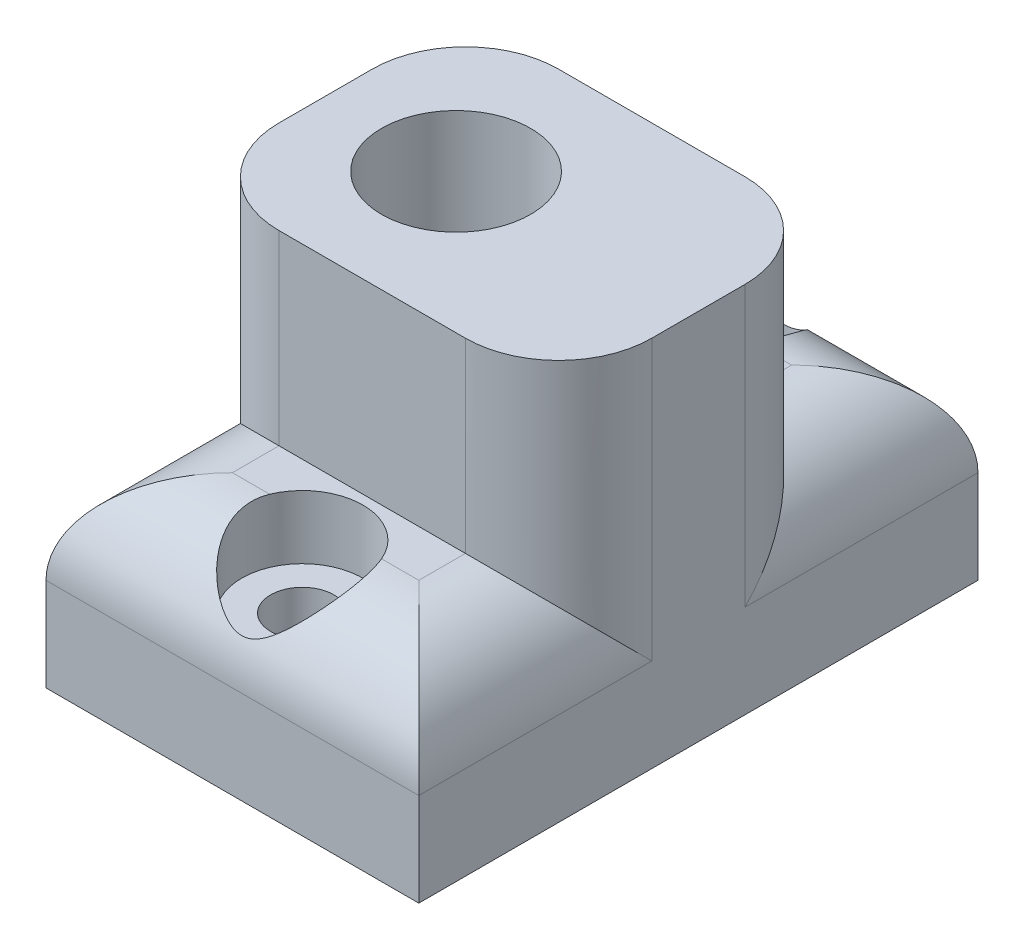
ISO-10303-21;
HEADER;
FILE_DESCRIPTION(('STEP AP214'),'2;1');
FILE_NAME('part.step','',(''),(''),'','','');
FILE_SCHEMA(('AUTOMOTIVE_DESIGN { 1 0 10303 214 1 1 1 1 }'));
ENDSEC;
DATA;
#1=APPLICATION_CONTEXT('core data for automotive mechanical design processes');
#2=APPLICATION_PROTOCOL_DEFINITION('international standard','automotive_design',2000,#1);
#3=PRODUCT_CONTEXT('',#1,'mechanical');
#4=PRODUCT('Part','Part','',(#3));
#5=PRODUCT_RELATED_PRODUCT_CATEGORY('part','',(#4));
#6=PRODUCT_DEFINITION_FORMATION('','',#4);
#7=PRODUCT_DEFINITION_CONTEXT('part definition',#1,'design');
#8=PRODUCT_DEFINITION('design','',#6,#7);
#9=PRODUCT_DEFINITION_SHAPE('','',#8);
#10=(LENGTH_UNIT() NAMED_UNIT(*) SI_UNIT(.MILLI.,.METRE.));
#11=(NAMED_UNIT(*) PLANE_ANGLE_UNIT() SI_UNIT($,.RADIAN.));
#12=(NAMED_UNIT(*) SI_UNIT($,.STERADIAN.) SOLID_ANGLE_UNIT());
#13=UNCERTAINTY_MEASURE_WITH_UNIT(LENGTH_MEASURE(1.E-05),#10,'distance_accuracy_value','');
#14=(GEOMETRIC_REPRESENTATION_CONTEXT(3) GLOBAL_UNCERTAINTY_ASSIGNED_CONTEXT((#13)) GLOBAL_UNIT_ASSIGNED_CONTEXT((#10,
#11,#12)) REPRESENTATION_CONTEXT('',''));
#15=CARTESIAN_POINT('',(0.,0.,0.));
#16=DIRECTION('',(0.,0.,1.));
#17=DIRECTION('',(1.,0.,0.));
#18=AXIS2_PLACEMENT_3D('',#15,#16,#17);
#19=CARTESIAN_POINT('',(-10.,20.,-15.));
#20=DIRECTION('',(0.,0.,1.));
#21=DIRECTION('',(1.,0.,0.));
#22=AXIS2_PLACEMENT_3D('',#19,#20,#21);
#23=PLANE('',#22);
#24=DIRECTION('',(0.,-1.,0.));
#25=VECTOR('',#24,1.);
#26=CARTESIAN_POINT('',(-10.,20.,-15.));
#27=LINE('',#26,#25);
#28=CARTESIAN_POINT('',(-10.,5.,-15.));
#29=VERTEX_POINT('',#28);
#30=CARTESIAN_POINT('',(-10.,0.,-15.));
#31=VERTEX_POINT('',#30);
#32=EDGE_CURVE('E159',#29,#31,#27,.T.);
#33=ORIENTED_EDGE('',*,*,#32,.F.);
#34=DIRECTION('',(-1.,0.,0.));
#35=VECTOR('',#34,1.);
#36=CARTESIAN_POINT('',(10.,5.,-15.));
#37=LINE('',#36,#35);
#38=CARTESIAN_POINT('',(10.,5.,-15.));
#39=VERTEX_POINT('',#38);
#40=EDGE_CURVE('E154',#29,#39,#37,.F.);
#41=ORIENTED_EDGE('',*,*,#40,.T.);
#42=DIRECTION('',(0.,-1.,0.));
#43=VECTOR('',#42,1.);
#44=CARTESIAN_POINT('',(10.,20.,-15.));
#45=LINE('',#44,#43);
#46=CARTESIAN_POINT('',(10.,0.,-15.));
#47=VERTEX_POINT('',#46);
#48=EDGE_CURVE('E148',#39,#47,#45,.T.);
#49=ORIENTED_EDGE('',*,*,#48,.T.);
#50=DIRECTION('',(-1.,0.,0.));
#51=VECTOR('',#50,1.);
#52=CARTESIAN_POINT('',(-10.,0.,-15.));
#53=LINE('',#52,#51);
#54=EDGE_CURVE('E151',#47,#31,#53,.T.);
#55=ORIENTED_EDGE('',*,*,#54,.T.);
#56=EDGE_LOOP('',(#33,#41,#49,#55));
#57=FACE_BOUND('',#56,.T.);
#58=ADVANCED_FACE('F33',(#57),#23,.F.);
#59=CARTESIAN_POINT('',(10.,20.,15.));
#60=DIRECTION('',(-1.,0.,0.));
#61=DIRECTION('',(0.,0.,1.));
#62=AXIS2_PLACEMENT_3D('',#59,#60,#61);
#63=PLANE('',#62);
#64=ORIENTED_EDGE('',*,*,#48,.F.);
#65=DIRECTION('',(0.,0.,-1.));
#66=VECTOR('',#65,1.);
#67=CARTESIAN_POINT('',(10.,5.,-7.5));
#68=LINE('',#67,#66);
#69=CARTESIAN_POINT('',(10.,5.,-2.5));
#70=VERTEX_POINT('',#69);
#71=EDGE_CURVE('E379',#39,#70,#68,.F.);
#72=ORIENTED_EDGE('',*,*,#71,.T.);
#73=DIRECTION('',(0.,1.,0.));
#74=VECTOR('',#73,1.);
#75=CARTESIAN_POINT('',(10.,20.,-2.5));
#76=LINE('',#75,#74);
#77=CARTESIAN_POINT('',(10.,20.,-2.5));
#78=VERTEX_POINT('',#77);
#79=EDGE_CURVE('E384',#70,#78,#76,.T.);
#80=ORIENTED_EDGE('',*,*,#79,.T.);
#81=DIRECTION('',(0.,0.,-1.));
#82=VECTOR('',#81,1.);
#83=CARTESIAN_POINT('',(10.,20.,15.));
#84=LINE('',#83,#82);
#85=CARTESIAN_POINT('',(10.,20.,2.5));
#86=VERTEX_POINT('',#85);
#87=EDGE_CURVE('E185',#86,#78,#84,.T.);
#88=ORIENTED_EDGE('',*,*,#87,.F.);
#89=DIRECTION('',(0.,1.,0.));
#90=VECTOR('',#89,1.);
#91=CARTESIAN_POINT('',(10.,20.,2.5));
#92=LINE('',#91,#90);
#93=CARTESIAN_POINT('',(10.,5.,2.5));
#94=VERTEX_POINT('',#93);
#95=EDGE_CURVE('E388',#86,#94,#92,.F.);
#96=ORIENTED_EDGE('',*,*,#95,.T.);
#97=DIRECTION('',(0.,0.,-1.));
#98=VECTOR('',#97,1.);
#99=CARTESIAN_POINT('',(10.,5.,15.));
#100=LINE('',#99,#98);
#101=CARTESIAN_POINT('',(10.,5.,15.));
#102=VERTEX_POINT('',#101);
#103=EDGE_CURVE('E385',#94,#102,#100,.F.);
#104=ORIENTED_EDGE('',*,*,#103,.T.);
#105=DIRECTION('',(0.,-1.,0.));
#106=VECTOR('',#105,1.);
#107=CARTESIAN_POINT('',(10.,20.,15.));
#108=LINE('',#107,#106);
#109=CARTESIAN_POINT('',(10.,0.,15.));
#110=VERTEX_POINT('',#109);
#111=EDGE_CURVE('E171',#102,#110,#108,.T.);
#112=ORIENTED_EDGE('',*,*,#111,.T.);
#113=DIRECTION('',(0.,0.,-1.));
#114=VECTOR('',#113,1.);
#115=CARTESIAN_POINT('',(10.,0.,15.));
#116=LINE('',#115,#114);
#117=EDGE_CURVE('E165',#110,#47,#116,.T.);
#118=ORIENTED_EDGE('',*,*,#117,.T.);
#119=EDGE_LOOP('',(#64,#72,#80,#88,#96,#104,#112,#118));
#120=FACE_BOUND('',#119,.T.);
#121=ADVANCED_FACE('F169',(#120),#63,.F.);
#122=CARTESIAN_POINT('',(-10.,20.,15.));
#123=DIRECTION('',(1.,0.,0.));
#124=DIRECTION('',(0.,0.,-1.));
#125=AXIS2_PLACEMENT_3D('',#122,#123,#124);
#126=PLANE('',#125);
#127=DIRECTION('',(0.,1.,0.));
#128=VECTOR('',#127,1.);
#129=CARTESIAN_POINT('',(-10.,20.,-2.5));
#130=LINE('',#129,#128);
#131=CARTESIAN_POINT('',(-10.,20.,-2.5));
#132=VERTEX_POINT('',#131);
#133=CARTESIAN_POINT('',(-10.,5.,-2.5));
#134=VERTEX_POINT('',#133);
#135=EDGE_CURVE('E410',#132,#134,#130,.F.);
#136=ORIENTED_EDGE('',*,*,#135,.T.);
#137=DIRECTION('',(0.,0.,1.));
#138=VECTOR('',#137,1.);
#139=CARTESIAN_POINT('',(-10.,5.,-15.));
#140=LINE('',#139,#138);
#141=EDGE_CURVE('E414',#134,#29,#140,.F.);
#142=ORIENTED_EDGE('',*,*,#141,.T.);
#143=ORIENTED_EDGE('',*,*,#32,.T.);
#144=DIRECTION('',(0.,0.,1.));
#145=VECTOR('',#144,1.);
#146=CARTESIAN_POINT('',(-10.,0.,15.));
#147=LINE('',#146,#145);
#148=CARTESIAN_POINT('',(-10.,0.,15.));
#149=VERTEX_POINT('',#148);
#150=EDGE_CURVE('E167',#31,#149,#147,.T.);
#151=ORIENTED_EDGE('',*,*,#150,.T.);
#152=DIRECTION('',(0.,-1.,0.));
#153=VECTOR('',#152,1.);
#154=CARTESIAN_POINT('',(-10.,20.,15.));
#155=LINE('',#154,#153);
#156=CARTESIAN_POINT('',(-10.,5.,15.));
#157=VERTEX_POINT('',#156);
#158=EDGE_CURVE('E187',#157,#149,#155,.T.);
#159=ORIENTED_EDGE('',*,*,#158,.F.);
#160=DIRECTION('',(0.,0.,1.));
#161=VECTOR('',#160,1.);
#162=CARTESIAN_POINT('',(-10.,5.,15.));
#163=LINE('',#162,#161);
#164=CARTESIAN_POINT('',(-10.,5.,2.5));
#165=VERTEX_POINT('',#164);
#166=EDGE_CURVE('E409',#157,#165,#163,.F.);
#167=ORIENTED_EDGE('',*,*,#166,.T.);
#168=DIRECTION('',(0.,1.,0.));
#169=VECTOR('',#168,1.);
#170=CARTESIAN_POINT('',(-10.,20.,2.5));
#171=LINE('',#170,#169);
#172=CARTESIAN_POINT('',(-10.,20.,2.5));
#173=VERTEX_POINT('',#172);
#174=EDGE_CURVE('E347',#165,#173,#171,.T.);
#175=ORIENTED_EDGE('',*,*,#174,.T.);
#176=DIRECTION('',(0.,0.,1.));
#177=VECTOR('',#176,1.);
#178=CARTESIAN_POINT('',(-10.,20.,15.));
#179=LINE('',#178,#177);
#180=EDGE_CURVE('E179',#132,#173,#179,.T.);
#181=ORIENTED_EDGE('',*,*,#180,.F.);
#182=EDGE_LOOP('',(#136,#142,#143,#151,#159,#167,#175,#181));
#183=FACE_BOUND('',#182,.T.);
#184=ADVANCED_FACE('F263',(#183),#126,.F.);
#185=CARTESIAN_POINT('',(-10.,20.,15.));
#186=DIRECTION('',(0.,0.,-1.));
#187=DIRECTION('',(-1.,0.,0.));
#188=AXIS2_PLACEMENT_3D('',#185,#186,#187);
#189=PLANE('',#188);
#190=ORIENTED_EDGE('',*,*,#111,.F.);
#191=DIRECTION('',(1.,0.,0.));
#192=VECTOR('',#191,1.);
#193=CARTESIAN_POINT('',(-10.,5.,15.));
#194=LINE('',#193,#192);
#195=EDGE_CURVE('E205',#102,#157,#194,.F.);
#196=ORIENTED_EDGE('',*,*,#195,.T.);
#197=ORIENTED_EDGE('',*,*,#158,.T.);
#198=DIRECTION('',(1.,0.,0.));
#199=VECTOR('',#198,1.);
#200=CARTESIAN_POINT('',(-10.,0.,15.));
#201=LINE('',#200,#199);
#202=EDGE_CURVE('E183',#149,#110,#201,.T.);
#203=ORIENTED_EDGE('',*,*,#202,.T.);
#204=EDGE_LOOP('',(#190,#196,#197,#203));
#205=FACE_BOUND('',#204,.T.);
#206=ADVANCED_FACE('F267',(#205),#189,.F.);
#207=CARTESIAN_POINT('',(0.,20.,0.));
#208=DIRECTION('',(0.,-1.,0.));
#209=DIRECTION('',(0.,0.,-1.));
#210=AXIS2_PLACEMENT_3D('',#207,#208,#209);
#211=PLANE('',#210);
#212=CARTESIAN_POINT('',(-3.,20.,0.));
#213=DIRECTION('',(0.,1.,0.));
#214=DIRECTION('',(0.,0.,1.));
#215=AXIS2_PLACEMENT_3D('',#212,#213,#214);
#216=CIRCLE('',#215,4.);
#217=CARTESIAN_POINT('',(-3.,20.,4.));
#218=VERTEX_POINT('',#217);
#219=EDGE_CURVE('E176',#218,#218,#216,.T.);
#220=ORIENTED_EDGE('',*,*,#219,.F.);
#221=EDGE_LOOP('',(#220));
#222=FACE_BOUND('',#221,.T.);
#223=DIRECTION('',(1.,0.,0.));
#224=VECTOR('',#223,1.);
#225=CARTESIAN_POINT('',(-10.,20.,-7.5));
#226=LINE('',#225,#224);
#227=CARTESIAN_POINT('',(-5.,20.,-7.5));
#228=VERTEX_POINT('',#227);
#229=CARTESIAN_POINT('',(5.,20.,-7.5));
#230=VERTEX_POINT('',#229);
#231=EDGE_CURVE('E317',#228,#230,#226,.T.);
#232=ORIENTED_EDGE('',*,*,#231,.F.);
#233=CARTESIAN_POINT('',(-5.,20.,-2.5));
#234=DIRECTION('',(0.,-1.,0.));
#235=DIRECTION('',(0.,0.,-1.));
#236=AXIS2_PLACEMENT_3D('',#233,#234,#235);
#237=CIRCLE('',#236,5.);
#238=EDGE_CURVE('E341',#228,#132,#237,.F.);
#239=ORIENTED_EDGE('',*,*,#238,.T.);
#240=ORIENTED_EDGE('',*,*,#180,.T.);
#241=CARTESIAN_POINT('',(-5.,20.,2.5));
#242=DIRECTION('',(0.,-1.,0.));
#243=DIRECTION('',(0.,0.,-1.));
#244=AXIS2_PLACEMENT_3D('',#241,#242,#243);
#245=CIRCLE('',#244,5.);
#246=CARTESIAN_POINT('',(-5.,20.,7.5));
#247=VERTEX_POINT('',#246);
#248=EDGE_CURVE('E50',#173,#247,#245,.F.);
#249=ORIENTED_EDGE('',*,*,#248,.T.);
#250=DIRECTION('',(-1.,0.,0.));
#251=VECTOR('',#250,1.);
#252=CARTESIAN_POINT('',(-10.,20.,7.5));
#253=LINE('',#252,#251);
#254=CARTESIAN_POINT('',(5.,20.,7.5));
#255=VERTEX_POINT('',#254);
#256=EDGE_CURVE('E327',#255,#247,#253,.T.);
#257=ORIENTED_EDGE('',*,*,#256,.F.);
#258=CARTESIAN_POINT('',(5.,20.,2.5));
#259=DIRECTION('',(0.,-1.,0.));
#260=DIRECTION('',(0.,0.,-1.));
#261=AXIS2_PLACEMENT_3D('',#258,#259,#260);
#262=CIRCLE('',#261,5.);
#263=EDGE_CURVE('E352',#255,#86,#262,.F.);
#264=ORIENTED_EDGE('',*,*,#263,.T.);
#265=ORIENTED_EDGE('',*,*,#87,.T.);
#266=CARTESIAN_POINT('',(5.,20.,-2.5));
#267=DIRECTION('',(0.,-1.,0.));
#268=DIRECTION('',(0.,0.,-1.));
#269=AXIS2_PLACEMENT_3D('',#266,#267,#268);
#270=CIRCLE('',#269,5.);
#271=EDGE_CURVE('E349',#78,#230,#270,.F.);
#272=ORIENTED_EDGE('',*,*,#271,.T.);
#273=EDGE_LOOP('',(#232,#239,#240,#249,#257,#264,#265,#272));
#274=FACE_BOUND('',#273,.T.);
#275=ADVANCED_FACE('F271',(#222,#274),#211,.F.);
#276=CARTESIAN_POINT('',(0.,0.,0.));
#277=DIRECTION('',(0.,-1.,0.));
#278=DIRECTION('',(0.,0.,-1.));
#279=AXIS2_PLACEMENT_3D('',#276,#277,#278);
#280=PLANE('',#279);
#281=CARTESIAN_POINT('',(0.,0.,11.25));
#282=DIRECTION('',(0.,1.,0.));
#283=DIRECTION('',(0.,0.,1.));
#284=AXIS2_PLACEMENT_3D('',#281,#282,#283);
#285=CIRCLE('',#284,1.7);
#286=CARTESIAN_POINT('',(0.,0.,12.95));
#287=VERTEX_POINT('',#286);
#288=EDGE_CURVE('E434',#287,#287,#285,.T.);
#289=ORIENTED_EDGE('',*,*,#288,.T.);
#290=EDGE_LOOP('',(#289));
#291=FACE_BOUND('',#290,.T.);
#292=CARTESIAN_POINT('',(0.,0.,-11.25));
#293=DIRECTION('',(0.,1.,0.));
#294=DIRECTION('',(0.,0.,1.));
#295=AXIS2_PLACEMENT_3D('',#292,#293,#294);
#296=CIRCLE('',#295,1.7);
#297=CARTESIAN_POINT('',(0.,0.,-9.55));
#298=VERTEX_POINT('',#297);
#299=EDGE_CURVE('E311',#298,#298,#296,.T.);
#300=ORIENTED_EDGE('',*,*,#299,.T.);
#301=EDGE_LOOP('',(#300));
#302=FACE_BOUND('',#301,.T.);
#303=ORIENTED_EDGE('',*,*,#117,.F.);
#304=ORIENTED_EDGE('',*,*,#202,.F.);
#305=ORIENTED_EDGE('',*,*,#150,.F.);
#306=ORIENTED_EDGE('',*,*,#54,.F.);
#307=EDGE_LOOP('',(#303,#304,#305,#306));
#308=FACE_BOUND('',#307,.T.);
#309=ADVANCED_FACE('F163',(#291,#302,#308),#280,.T.);
#310=CARTESIAN_POINT('',(-3.,10.,0.));
#311=DIRECTION('',(0.,1.,0.));
#312=DIRECTION('',(0.,0.,1.));
#313=AXIS2_PLACEMENT_3D('',#310,#311,#312);
#314=CYLINDRICAL_SURFACE('',#313,4.);
#315=CARTESIAN_POINT('',(-3.,10.,0.));
#316=DIRECTION('',(0.,1.,0.));
#317=DIRECTION('',(0.,0.,1.));
#318=AXIS2_PLACEMENT_3D('',#315,#316,#317);
#319=CIRCLE('',#318,4.);
#320=CARTESIAN_POINT('',(-3.,10.,4.));
#321=VERTEX_POINT('',#320);
#322=EDGE_CURVE('E173',#321,#321,#319,.T.);
#323=ORIENTED_EDGE('',*,*,#322,.F.);
#324=EDGE_LOOP('',(#323));
#325=FACE_BOUND('',#324,.T.);
#326=ORIENTED_EDGE('',*,*,#219,.T.);
#327=EDGE_LOOP('',(#326));
#328=FACE_BOUND('',#327,.T.);
#329=ADVANCED_FACE('F275',(#325,#328),#314,.F.);
#330=CARTESIAN_POINT('',(-3.,10.,0.));
#331=DIRECTION('',(0.,1.,0.));
#332=DIRECTION('',(0.,0.,1.));
#333=AXIS2_PLACEMENT_3D('',#330,#331,#332);
#334=PLANE('',#333);
#335=ORIENTED_EDGE('',*,*,#322,.T.);
#336=EDGE_LOOP('',(#335));
#337=FACE_BOUND('',#336,.T.);
#338=ADVANCED_FACE('F282',(#337),#334,.T.);
#339=CARTESIAN_POINT('',(-10.,10.,-7.5));
#340=DIRECTION('',(0.,0.,1.));
#341=DIRECTION('',(1.,0.,0.));
#342=AXIS2_PLACEMENT_3D('',#339,#340,#341);
#343=PLANE('',#342);
#344=DIRECTION('',(1.,0.,0.));
#345=VECTOR('',#344,1.);
#346=CARTESIAN_POINT('',(-10.,10.,-7.5));
#347=LINE('',#346,#345);
#348=CARTESIAN_POINT('',(-5.,10.,-7.5));
#349=VERTEX_POINT('',#348);
#350=CARTESIAN_POINT('',(5.,10.,-7.5));
#351=VERTEX_POINT('',#350);
#352=EDGE_CURVE('E329',#349,#351,#347,.T.);
#353=ORIENTED_EDGE('',*,*,#352,.F.);
#354=DIRECTION('',(0.,1.,0.));
#355=VECTOR('',#354,1.);
#356=CARTESIAN_POINT('',(-5.,10.,-7.5));
#357=LINE('',#356,#355);
#358=EDGE_CURVE('E392',#349,#228,#357,.T.);
#359=ORIENTED_EDGE('',*,*,#358,.T.);
#360=ORIENTED_EDGE('',*,*,#231,.T.);
#361=DIRECTION('',(0.,1.,0.));
#362=VECTOR('',#361,1.);
#363=CARTESIAN_POINT('',(5.,10.,-7.5));
#364=LINE('',#363,#362);
#365=EDGE_CURVE('E383',#230,#351,#364,.F.);
#366=ORIENTED_EDGE('',*,*,#365,.T.);
#367=EDGE_LOOP('',(#353,#359,#360,#366));
#368=FACE_BOUND('',#367,.T.);
#369=ADVANCED_FACE('F286',(#368),#343,.F.);
#370=CARTESIAN_POINT('',(0.,10.,0.));
#371=DIRECTION('',(0.,1.,0.));
#372=DIRECTION('',(0.,0.,1.));
#373=AXIS2_PLACEMENT_3D('',#370,#371,#372);
#374=PLANE('',#373);
#375=DIRECTION('',(-1.,0.,0.));
#376=VECTOR('',#375,1.);
#377=CARTESIAN_POINT('',(-10.,10.,-9.99999999999999));
#378=LINE('',#377,#376);
#379=CARTESIAN_POINT('',(-3.,10.,-9.99999999999999));
#380=VERTEX_POINT('',#379);
#381=CARTESIAN_POINT('',(-5.,10.,-9.99999999999999));
#382=VERTEX_POINT('',#381);
#383=EDGE_CURVE('E418',#380,#382,#378,.T.);
#384=ORIENTED_EDGE('',*,*,#383,.T.);
#385=DIRECTION('',(0.,0.,1.));
#386=VECTOR('',#385,1.);
#387=CARTESIAN_POINT('',(-5.,10.,-7.5));
#388=LINE('',#387,#386);
#389=EDGE_CURVE('E240',#382,#349,#388,.T.);
#390=ORIENTED_EDGE('',*,*,#389,.T.);
#391=ORIENTED_EDGE('',*,*,#352,.T.);
#392=DIRECTION('',(0.,0.,-1.));
#393=VECTOR('',#392,1.);
#394=CARTESIAN_POINT('',(5.,10.,-15.));
#395=LINE('',#394,#393);
#396=CARTESIAN_POINT('',(5.,10.,-9.99999999999999));
#397=VERTEX_POINT('',#396);
#398=EDGE_CURVE('E380',#351,#397,#395,.T.);
#399=ORIENTED_EDGE('',*,*,#398,.T.);
#400=DIRECTION('',(-1.,0.,0.));
#401=VECTOR('',#400,1.);
#402=CARTESIAN_POINT('',(-10.,10.,-9.99999999999999));
#403=LINE('',#402,#401);
#404=CARTESIAN_POINT('',(3.,10.,-9.99999999999999));
#405=VERTEX_POINT('',#404);
#406=EDGE_CURVE('E417',#397,#405,#403,.T.);
#407=ORIENTED_EDGE('',*,*,#406,.T.);
#408=CARTESIAN_POINT('',(0.,10.,-11.25));
#409=DIRECTION('',(0.,1.,0.));
#410=DIRECTION('',(0.,0.,1.));
#411=AXIS2_PLACEMENT_3D('',#408,#409,#410);
#412=CIRCLE('',#411,3.25);
#413=EDGE_CURVE('E320',#380,#405,#412,.T.);
#414=ORIENTED_EDGE('',*,*,#413,.F.);
#415=EDGE_LOOP('',(#384,#390,#391,#399,#407,#414));
#416=FACE_BOUND('',#415,.T.);
#417=ADVANCED_FACE('F290',(#416),#374,.T.);
#418=CARTESIAN_POINT('',(-10.,10.,7.5));
#419=DIRECTION('',(0.,0.,-1.));
#420=DIRECTION('',(-1.,0.,0.));
#421=AXIS2_PLACEMENT_3D('',#418,#419,#420);
#422=PLANE('',#421);
#423=ORIENTED_EDGE('',*,*,#256,.T.);
#424=DIRECTION('',(0.,1.,0.));
#425=VECTOR('',#424,1.);
#426=CARTESIAN_POINT('',(-5.,10.,7.5));
#427=LINE('',#426,#425);
#428=CARTESIAN_POINT('',(-5.,10.,7.5));
#429=VERTEX_POINT('',#428);
#430=EDGE_CURVE('E11',#247,#429,#427,.F.);
#431=ORIENTED_EDGE('',*,*,#430,.T.);
#432=DIRECTION('',(-1.,0.,0.));
#433=VECTOR('',#432,1.);
#434=CARTESIAN_POINT('',(-10.,10.,7.5));
#435=LINE('',#434,#433);
#436=CARTESIAN_POINT('',(5.,10.,7.5));
#437=VERTEX_POINT('',#436);
#438=EDGE_CURVE('E324',#437,#429,#435,.T.);
#439=ORIENTED_EDGE('',*,*,#438,.F.);
#440=DIRECTION('',(0.,1.,0.));
#441=VECTOR('',#440,1.);
#442=CARTESIAN_POINT('',(5.,10.,7.5));
#443=LINE('',#442,#441);
#444=EDGE_CURVE('E42',#437,#255,#443,.T.);
#445=ORIENTED_EDGE('',*,*,#444,.T.);
#446=EDGE_LOOP('',(#423,#431,#439,#445));
#447=FACE_BOUND('',#446,.T.);
#448=ADVANCED_FACE('F294',(#447),#422,.F.);
#449=CARTESIAN_POINT('',(0.,10.,0.));
#450=DIRECTION('',(0.,-1.,0.));
#451=DIRECTION('',(0.,0.,-1.));
#452=AXIS2_PLACEMENT_3D('',#449,#450,#451);
#453=PLANE('',#452);
#454=DIRECTION('',(0.,0.,1.));
#455=VECTOR('',#454,1.);
#456=CARTESIAN_POINT('',(-5.,10.,0.));
#457=LINE('',#456,#455);
#458=CARTESIAN_POINT('',(-5.,10.,10.));
#459=VERTEX_POINT('',#458);
#460=EDGE_CURVE('E193',#429,#459,#457,.T.);
#461=ORIENTED_EDGE('',*,*,#460,.T.);
#462=DIRECTION('',(1.,0.,0.));
#463=VECTOR('',#462,1.);
#464=CARTESIAN_POINT('',(0.,10.,10.));
#465=LINE('',#464,#463);
#466=CARTESIAN_POINT('',(-3.,10.,10.));
#467=VERTEX_POINT('',#466);
#468=EDGE_CURVE('E195',#459,#467,#465,.T.);
#469=ORIENTED_EDGE('',*,*,#468,.T.);
#470=CARTESIAN_POINT('',(0.,10.,11.25));
#471=DIRECTION('',(0.,1.,0.));
#472=DIRECTION('',(0.,0.,1.));
#473=AXIS2_PLACEMENT_3D('',#470,#471,#472);
#474=CIRCLE('',#473,3.25);
#475=CARTESIAN_POINT('',(3.,10.,10.));
#476=VERTEX_POINT('',#475);
#477=EDGE_CURVE('E368',#476,#467,#474,.T.);
#478=ORIENTED_EDGE('',*,*,#477,.F.);
#479=DIRECTION('',(1.,0.,0.));
#480=VECTOR('',#479,1.);
#481=CARTESIAN_POINT('',(0.,10.,10.));
#482=LINE('',#481,#480);
#483=CARTESIAN_POINT('',(5.,10.,10.));
#484=VERTEX_POINT('',#483);
#485=EDGE_CURVE('E191',#476,#484,#482,.T.);
#486=ORIENTED_EDGE('',*,*,#485,.T.);
#487=DIRECTION('',(0.,0.,-1.));
#488=VECTOR('',#487,1.);
#489=CARTESIAN_POINT('',(5.,10.,0.));
#490=LINE('',#489,#488);
#491=EDGE_CURVE('E158',#484,#437,#490,.T.);
#492=ORIENTED_EDGE('',*,*,#491,.T.);
#493=ORIENTED_EDGE('',*,*,#438,.T.);
#494=EDGE_LOOP('',(#461,#469,#478,#486,#492,#493));
#495=FACE_BOUND('',#494,.T.);
#496=ADVANCED_FACE('F298',(#495),#453,.F.);
#497=CARTESIAN_POINT('',(0.,10.,-11.25));
#498=DIRECTION('',(0.,1.,0.));
#499=DIRECTION('',(0.,0.,1.));
#500=AXIS2_PLACEMENT_3D('',#497,#498,#499);
#501=CYLINDRICAL_SURFACE('',#500,1.7);
#502=ORIENTED_EDGE('',*,*,#299,.F.);
#503=EDGE_LOOP('',(#502));
#504=FACE_BOUND('',#503,.T.);
#505=CARTESIAN_POINT('',(0.,6.6,-11.25));
#506=DIRECTION('',(0.,1.,0.));
#507=DIRECTION('',(0.,0.,1.));
#508=AXIS2_PLACEMENT_3D('',#505,#506,#507);
#509=CIRCLE('',#508,1.70000000000001);
#510=CARTESIAN_POINT('',(0.,6.6,-9.54999999999998));
#511=VERTEX_POINT('',#510);
#512=EDGE_CURVE('E314',#511,#511,#509,.T.);
#513=ORIENTED_EDGE('',*,*,#512,.T.);
#514=EDGE_LOOP('',(#513));
#515=FACE_BOUND('',#514,.T.);
#516=ADVANCED_FACE('F300',(#504,#515),#501,.F.);
#517=CARTESIAN_POINT('',(1.70000000000001,6.6,-11.25));
#518=DIRECTION('',(0.,-1.,0.));
#519=DIRECTION('',(0.,0.,-1.));
#520=AXIS2_PLACEMENT_3D('',#517,#518,#519);
#521=PLANE('',#520);
#522=ORIENTED_EDGE('',*,*,#512,.F.);
#523=EDGE_LOOP('',(#522));
#524=FACE_BOUND('',#523,.T.);
#525=CARTESIAN_POINT('',(0.,6.6,-11.25));
#526=DIRECTION('',(0.,1.,0.));
#527=DIRECTION('',(0.,0.,1.));
#528=AXIS2_PLACEMENT_3D('',#525,#526,#527);
#529=CIRCLE('',#528,3.25);
#530=CARTESIAN_POINT('',(0.,6.6,-8.));
#531=VERTEX_POINT('',#530);
#532=EDGE_CURVE('E315',#531,#531,#529,.T.);
#533=ORIENTED_EDGE('',*,*,#532,.T.);
#534=EDGE_LOOP('',(#533));
#535=FACE_BOUND('',#534,.T.);
#536=ADVANCED_FACE('F229',(#524,#535),#521,.F.);
#537=CARTESIAN_POINT('',(0.,10.,-11.25));
#538=DIRECTION('',(0.,1.,0.));
#539=DIRECTION('',(0.,0.,1.));
#540=AXIS2_PLACEMENT_3D('',#537,#538,#539);
#541=CYLINDRICAL_SURFACE('',#540,3.25);
#542=ORIENTED_EDGE('',*,*,#532,.F.);
#543=EDGE_LOOP('',(#542));
#544=FACE_BOUND('',#543,.T.);
#545=ORIENTED_EDGE('',*,*,#413,.T.);
#546=CARTESIAN_POINT('',(3.,10.,-9.99999999999999));
#547=CARTESIAN_POINT('',(3.03055937924477,10.0000128675384,-10.073307361528));
#548=CARTESIAN_POINT('',(3.05840871285706,9.99838802438193,-10.1477496820946));
#549=CARTESIAN_POINT('',(3.10855202484888,9.99165773886059,-10.2983283964932));
#550=CARTESIAN_POINT('',(3.13084595201058,9.98655226440777,-10.3744648059369));
#551=CARTESIAN_POINT('',(3.16966882802174,9.97268189408961,-10.5275634856466));
#552=CARTESIAN_POINT('',(3.18621932934839,9.96393095625873,-10.6045215263907));
#553=CARTESIAN_POINT('',(3.21364003367202,9.9426864861669,-10.7589046166897));
#554=CARTESIAN_POINT('',(3.22451062449662,9.9301932095267,-10.8363296339939));
#555=CARTESIAN_POINT('',(3.24864767959643,9.88701779755708,-11.0685209365944));
#556=CARTESIAN_POINT('',(3.25344441809831,9.85063832677145,-11.2232234696328));
#557=CARTESIAN_POINT('',(3.24171467366858,9.76357063844868,-11.5275920519489));
#558=CARTESIAN_POINT('',(3.22518037789644,9.71287718349372,-11.6772562352427));
#559=CARTESIAN_POINT('',(3.17242357896708,9.5975094719761,-11.9719514650288));
#560=CARTESIAN_POINT('',(3.13570364206899,9.53250796237872,-12.1167630365935));
#561=CARTESIAN_POINT('',(3.04503883849923,9.39168565208948,-12.3953061537666));
#562=CARTESIAN_POINT('',(2.99108345420082,9.31585826076192,-12.5290308708948));
#563=CARTESIAN_POINT('',(2.8847538898632,9.17695471629095,-12.7505222948963));
#564=CARTESIAN_POINT('',(2.83569971099045,9.11577375834996,-12.8411228783756));
#565=CARTESIAN_POINT('',(2.73056016504681,8.98979583093455,-13.0154752495969));
#566=CARTESIAN_POINT('',(2.67447435149198,8.92499863198671,-13.0992266018786));
#567=CARTESIAN_POINT('',(2.55583444958578,8.79250366435655,-13.2600310912979));
#568=CARTESIAN_POINT('',(2.49326279705477,8.72479832633775,-13.337064941713));
#569=CARTESIAN_POINT('',(2.36231866185206,8.5875438260834,-13.4841997685489));
#570=CARTESIAN_POINT('',(2.29394710199353,8.51799495837481,-13.554301844043));
#571=CARTESIAN_POINT('',(2.15031204676177,8.37657633473453,-13.6889633198926));
#572=CARTESIAN_POINT('',(2.07493932372957,8.3046878476111,-13.7533863417371));
#573=CARTESIAN_POINT('',(1.91854241151598,8.16099912930617,-13.8751713145459));
#574=CARTESIAN_POINT('',(1.83751616785451,8.0891989399591,-13.9325306774312));
#575=CARTESIAN_POINT('',(1.66986020099455,7.9472871231135,-14.0399743303233));
#576=CARTESIAN_POINT('',(1.58324693557316,7.87717130239535,-14.0900786932095));
#577=CARTESIAN_POINT('',(1.40370727665615,7.7403589620417,-14.1829711532236));
#578=CARTESIAN_POINT('',(1.31078659364091,7.67365944295527,-14.2257657480528));
#579=CARTESIAN_POINT('',(1.1291781287058,7.55414777883203,-14.2989108265505));
#580=CARTESIAN_POINT('',(1.0413163518984,7.50062914314573,-14.3301378648593));
#581=CARTESIAN_POINT('',(0.859081938323946,7.4015725964677,-14.3858484887116));
#582=CARTESIAN_POINT('',(0.764713016140843,7.35603018398501,-14.4103358823549));
#583=CARTESIAN_POINT('',(0.583032776125148,7.28320032337881,-14.4484210976395));
#584=CARTESIAN_POINT('',(0.496638923007982,7.25423451352821,-14.4630747900927));
#585=CARTESIAN_POINT('',(0.319715676449067,7.20937102462082,-14.4854572418181));
#586=CARTESIAN_POINT('',(0.229197281437821,7.19344051801346,-14.4932034011765));
#587=CARTESIAN_POINT('',(0.0455688251481261,7.17743429215733,-14.5009865982932));
#588=CARTESIAN_POINT('',(-0.0475567257687102,7.17749449615345,-14.5009575456616));
#589=CARTESIAN_POINT('',(-0.232064105080414,7.19380665813104,-14.4930252297573));
#590=CARTESIAN_POINT('',(-0.323443253721004,7.21008173635119,-14.4851107228825));
#591=CARTESIAN_POINT('',(-0.522606460563384,7.26112383717734,-14.4596275996897));
#592=CARTESIAN_POINT('',(-0.629237377481461,7.29932199287469,-14.4402359274891));
#593=CARTESIAN_POINT('',(-0.834851206580767,7.38882583231705,-14.3927290259868));
#594=CARTESIAN_POINT('',(-0.933806017635419,7.44017696559845,-14.364583474284));
#595=CARTESIAN_POINT('',(-1.11790389315662,7.5469037386895,-14.3031176778644));
#596=CARTESIAN_POINT('',(-1.20352889789801,7.60175156461319,-14.2702930828706));
#597=CARTESIAN_POINT('',(-1.36943001392093,7.71564738959889,-14.1987841024411));
#598=CARTESIAN_POINT('',(-1.44970152110084,7.77469891594995,-14.1600947644647));
#599=CARTESIAN_POINT('',(-1.60553512075794,7.89526074336088,-14.0771109199507));
#600=CARTESIAN_POINT('',(-1.681090415128,7.95677439307752,-14.0328085889983));
#601=CARTESIAN_POINT('',(-1.8277127561544,8.08091955735227,-13.9387817015098));
#602=CARTESIAN_POINT('',(-1.89878114099973,8.14355073140076,-13.8890587738071));
#603=CARTESIAN_POINT('',(-2.04355564565754,8.2753348265031,-13.7789249844899));
#604=CARTESIAN_POINT('',(-2.11680843510182,8.34451027255641,-13.7179421630851));
#605=CARTESIAN_POINT('',(-2.25805031778839,8.48210241178456,-13.5894075114658));
#606=CARTESIAN_POINT('',(-2.32603853589636,8.55051897719745,-13.5218545932908));
#607=CARTESIAN_POINT('',(-2.52158398795917,8.75313517353583,-13.3094027327122));
#608=CARTESIAN_POINT('',(-2.64105047476201,8.8850066330828,-13.1544626911206));
#609=CARTESIAN_POINT('',(-2.83670698048042,9.11557716228417,-12.8448499540576));
#610=CARTESIAN_POINT('',(-2.91675883998475,9.21621493735391,-12.6940621775801));
#611=CARTESIAN_POINT('',(-3.05412712373703,9.40397566878302,-12.3746964638084));
#612=CARTESIAN_POINT('',(-3.1114700325954,9.49111429602706,-12.206139542374));
#613=CARTESIAN_POINT('',(-3.19156692394476,9.63506014862972,-11.8821241414658));
#614=CARTESIAN_POINT('',(-3.21837849676759,9.69448832233062,-11.7288632795884));
#615=CARTESIAN_POINT('',(-3.24181550325639,9.77240483920411,-11.4936604230264));
#616=CARTESIAN_POINT('',(-3.24682942397002,9.79651525827616,-11.4143333896114));
#617=CARTESIAN_POINT('',(-3.25097894461097,9.84078818563261,-11.2544457961269));
#618=CARTESIAN_POINT('',(-3.25011691315535,9.86095228132235,-11.1738857461556));
#619=CARTESIAN_POINT('',(-3.24227514740712,9.89728219988576,-11.0117171541854));
#620=CARTESIAN_POINT('',(-3.23526323330556,9.91342641703603,-10.9301053252155));
#621=CARTESIAN_POINT('',(-3.21495518049494,9.94151769608693,-10.766973497385));
#622=CARTESIAN_POINT('',(-3.20166174578431,9.95346656010202,-10.6854534741259));
#623=CARTESIAN_POINT('',(-3.16879456767122,9.97320890863289,-10.5233120868558));
#624=CARTESIAN_POINT('',(-3.14923010621044,9.98100848953371,-10.4426895757665));
#625=CARTESIAN_POINT('',(-3.10390256176766,9.9926286493448,-10.2829565011397));
#626=CARTESIAN_POINT('',(-3.07814364455791,9.99645189318005,-10.2038449599061));
#627=CARTESIAN_POINT('',(-3.04158708770714,9.99894901437322,-10.1046802234963));
#628=CARTESIAN_POINT('',(-3.03356975520529,9.99934499395099,-10.0836109654319));
#629=CARTESIAN_POINT('',(-3.01710686427076,9.99987026728956,-10.0416653772365));
#630=CARTESIAN_POINT('',(-3.00866181553022,9.99999987115885,-10.0207888509636));
#631=CARTESIAN_POINT('',(-2.99999999999999,10.,-9.99999999999999));
#632=B_SPLINE_CURVE_WITH_KNOTS('',3,(#546,#547,#548,#549,#550,#551,#552,#553,#554,#555,#556,
#557,#558,#559,#560,#561,#562,#563,#564,#565,#566,#567,#568,#569,#570,#571,#572,#573,#574,#575,
#576,#577,#578,#579,#580,#581,#582,#583,#584,#585,#586,#587,#588,#589,#590,#591,#592,#593,#594,
#595,#596,#597,#598,#599,#600,#601,#602,#603,#604,#605,#606,#607,#608,#609,#610,#611,#612,#613,
#614,#615,#616,#617,#618,#619,#620,#621,#622,#623,#624,#625,#626,#627,#628,#629,#630,#631),
.UNSPECIFIED.,.F.,.F.,(4,2,2,2,2,2,2,2,2,2,2,2,2,2,2,2,2,2,2,2,2,2,2,2,2,2,2,2,2,2,2,2,2,2,2,2,
2,2,2,2,2,2,4),(0.,0.238201558516376,0.476405313040615,0.713705277483829,0.950989036827473,
1.42549532115525,1.90017545052913,2.38711452222045,2.87435130933722,3.23337542817225,
3.59242235532622,3.9524683561341,4.31245717771379,4.67953699431856,5.04675090895435,
5.4129285767963,5.77877903356029,6.10081064449966,6.4226599226946,6.698534006417,
6.97371118366321,7.25122747908581,7.52914004269889,7.87196095945033,8.21598284717347,
8.53609299871426,8.85647499208443,9.17730861012165,9.49804608533267,9.85103458747058,
10.2040816417898,10.9086522453949,11.5010468673293,12.0927485521752,12.5900928957189,
12.839013058131,13.087832885882,13.3379625055988,13.5879845502801,13.8376382252982,
14.0871244754061,14.15476027478,14.2223172894056),.UNSPECIFIED.);
#633=EDGE_CURVE('E233',#405,#380,#632,.T.);
#634=ORIENTED_EDGE('',*,*,#633,.T.);
#635=EDGE_LOOP('',(#545,#634));
#636=FACE_BOUND('',#635,.T.);
#637=ADVANCED_FACE('F224',(#544,#636),#541,.F.);
#638=CARTESIAN_POINT('',(0.,10.,11.25));
#639=DIRECTION('',(0.,1.,0.));
#640=DIRECTION('',(0.,0.,1.));
#641=AXIS2_PLACEMENT_3D('',#638,#639,#640);
#642=CYLINDRICAL_SURFACE('',#641,1.7);
#643=ORIENTED_EDGE('',*,*,#288,.F.);
#644=EDGE_LOOP('',(#643));
#645=FACE_BOUND('',#644,.T.);
#646=CARTESIAN_POINT('',(0.,6.6,11.25));
#647=DIRECTION('',(0.,1.,0.));
#648=DIRECTION('',(0.,0.,1.));
#649=AXIS2_PLACEMENT_3D('',#646,#647,#648);
#650=CIRCLE('',#649,1.70000000000001);
#651=CARTESIAN_POINT('',(0.,6.6,12.95));
#652=VERTEX_POINT('',#651);
#653=EDGE_CURVE('E436',#652,#652,#650,.T.);
#654=ORIENTED_EDGE('',*,*,#653,.T.);
#655=EDGE_LOOP('',(#654));
#656=FACE_BOUND('',#655,.T.);
#657=ADVANCED_FACE('F220',(#645,#656),#642,.F.);
#658=CARTESIAN_POINT('',(1.70000000000001,6.6,11.25));
#659=DIRECTION('',(0.,-1.,0.));
#660=DIRECTION('',(0.,0.,-1.));
#661=AXIS2_PLACEMENT_3D('',#658,#659,#660);
#662=PLANE('',#661);
#663=ORIENTED_EDGE('',*,*,#653,.F.);
#664=EDGE_LOOP('',(#663));
#665=FACE_BOUND('',#664,.T.);
#666=CARTESIAN_POINT('',(0.,6.6,11.25));
#667=DIRECTION('',(0.,1.,0.));
#668=DIRECTION('',(0.,0.,1.));
#669=AXIS2_PLACEMENT_3D('',#666,#667,#668);
#670=CIRCLE('',#669,3.25);
#671=CARTESIAN_POINT('',(0.,6.6,14.5));
#672=VERTEX_POINT('',#671);
#673=EDGE_CURVE('E441',#672,#672,#670,.T.);
#674=ORIENTED_EDGE('',*,*,#673,.T.);
#675=EDGE_LOOP('',(#674));
#676=FACE_BOUND('',#675,.T.);
#677=ADVANCED_FACE('F216',(#665,#676),#662,.F.);
#678=CARTESIAN_POINT('',(0.,10.,11.25));
#679=DIRECTION('',(0.,1.,0.));
#680=DIRECTION('',(0.,0.,1.));
#681=AXIS2_PLACEMENT_3D('',#678,#679,#680);
#682=CYLINDRICAL_SURFACE('',#681,3.25);
#683=ORIENTED_EDGE('',*,*,#673,.F.);
#684=EDGE_LOOP('',(#683));
#685=FACE_BOUND('',#684,.T.);
#686=ORIENTED_EDGE('',*,*,#477,.T.);
#687=CARTESIAN_POINT('',(-3.,10.,10.));
#688=CARTESIAN_POINT('',(-3.03055937924477,10.0000128675384,10.073307361528));
#689=CARTESIAN_POINT('',(-3.05840871285706,9.99838802438193,10.1477496820946));
#690=CARTESIAN_POINT('',(-3.10855202484888,9.99165773886059,10.2983283964932));
#691=CARTESIAN_POINT('',(-3.13084595201058,9.98655226440777,10.3744648059369));
#692=CARTESIAN_POINT('',(-3.16966882802174,9.97268189408961,10.5275634856466));
#693=CARTESIAN_POINT('',(-3.18621932934839,9.96393095625873,10.6045215263907));
#694=CARTESIAN_POINT('',(-3.21364003367202,9.9426864861669,10.7589046166897));
#695=CARTESIAN_POINT('',(-3.22451062449662,9.9301932095267,10.8363296339939));
#696=CARTESIAN_POINT('',(-3.24864767959643,9.88701779755708,11.0685209365944));
#697=CARTESIAN_POINT('',(-3.25344441809831,9.85063832677145,11.2232234696329));
#698=CARTESIAN_POINT('',(-3.24171467366858,9.76357063844868,11.5275920519489));
#699=CARTESIAN_POINT('',(-3.22518037789644,9.71287718349372,11.6772562352427));
#700=CARTESIAN_POINT('',(-3.17242357896708,9.5975094719761,11.9719514650288));
#701=CARTESIAN_POINT('',(-3.13570364206899,9.53250796237872,12.1167630365935));
#702=CARTESIAN_POINT('',(-3.04503883849923,9.39168565208948,12.3953061537666));
#703=CARTESIAN_POINT('',(-2.99108345420082,9.31585826076192,12.5290308708948));
#704=CARTESIAN_POINT('',(-2.8847538898632,9.17695471629095,12.7505222948963));
#705=CARTESIAN_POINT('',(-2.83569971099045,9.11577375834996,12.8411228783756));
#706=CARTESIAN_POINT('',(-2.73056016504681,8.98979583093455,13.0154752495969));
#707=CARTESIAN_POINT('',(-2.67447435149198,8.92499863198671,13.0992266018786));
#708=CARTESIAN_POINT('',(-2.55583444958578,8.79250366435655,13.2600310912979));
#709=CARTESIAN_POINT('',(-2.49326279705477,8.72479832633775,13.337064941713));
#710=CARTESIAN_POINT('',(-2.36231866185206,8.5875438260834,13.484199768549));
#711=CARTESIAN_POINT('',(-2.29394710199353,8.51799495837481,13.554301844043));
#712=CARTESIAN_POINT('',(-2.15031204676177,8.37657633473453,13.6889633198926));
#713=CARTESIAN_POINT('',(-2.07493932372957,8.3046878476111,13.7533863417371));
#714=CARTESIAN_POINT('',(-1.91854241151598,8.16099912930617,13.8751713145459));
#715=CARTESIAN_POINT('',(-1.83751616785451,8.0891989399591,13.9325306774312));
#716=CARTESIAN_POINT('',(-1.66986020099455,7.9472871231135,14.0399743303233));
#717=CARTESIAN_POINT('',(-1.58324693557316,7.87717130239535,14.0900786932095));
#718=CARTESIAN_POINT('',(-1.40370727665615,7.7403589620417,14.1829711532236));
#719=CARTESIAN_POINT('',(-1.31078659364091,7.67365944295527,14.2257657480528));
#720=CARTESIAN_POINT('',(-1.1291781287058,7.55414777883203,14.2989108265505));
#721=CARTESIAN_POINT('',(-1.0413163518984,7.50062914314573,14.3301378648593));
#722=CARTESIAN_POINT('',(-0.859081938323946,7.4015725964677,14.3858484887116));
#723=CARTESIAN_POINT('',(-0.764713016140843,7.35603018398501,14.4103358823549));
#724=CARTESIAN_POINT('',(-0.583032776125148,7.28320032337881,14.4484210976395));
#725=CARTESIAN_POINT('',(-0.496638923007982,7.25423451352821,14.4630747900927));
#726=CARTESIAN_POINT('',(-0.319715676449067,7.20937102462082,14.4854572418181));
#727=CARTESIAN_POINT('',(-0.229197281437821,7.19344051801346,14.4932034011765));
#728=CARTESIAN_POINT('',(-0.0455688251481261,7.17743429215733,14.5009865982932));
#729=CARTESIAN_POINT('',(0.0475567257687102,7.17749449615345,14.5009575456616));
#730=CARTESIAN_POINT('',(0.232064105080414,7.19380665813104,14.4930252297573));
#731=CARTESIAN_POINT('',(0.323443253721004,7.21008173635119,14.4851107228825));
#732=CARTESIAN_POINT('',(0.522606460563384,7.26112383717734,14.4596275996897));
#733=CARTESIAN_POINT('',(0.629237377481461,7.29932199287469,14.4402359274891));
#734=CARTESIAN_POINT('',(0.834851206580767,7.38882583231705,14.3927290259868));
#735=CARTESIAN_POINT('',(0.933806017635419,7.44017696559845,14.364583474284));
#736=CARTESIAN_POINT('',(1.11790389315662,7.5469037386895,14.3031176778644));
#737=CARTESIAN_POINT('',(1.20352889789801,7.60175156461319,14.2702930828706));
#738=CARTESIAN_POINT('',(1.36943001392093,7.71564738959889,14.1987841024411));
#739=CARTESIAN_POINT('',(1.44970152110084,7.77469891594995,14.1600947644647));
#740=CARTESIAN_POINT('',(1.60553512075794,7.89526074336088,14.0771109199507));
#741=CARTESIAN_POINT('',(1.681090415128,7.95677439307752,14.0328085889983));
#742=CARTESIAN_POINT('',(1.8277127561544,8.08091955735227,13.9387817015098));
#743=CARTESIAN_POINT('',(1.89878114099973,8.14355073140076,13.8890587738071));
#744=CARTESIAN_POINT('',(2.04355564565754,8.2753348265031,13.7789249844899));
#745=CARTESIAN_POINT('',(2.11680843510182,8.34451027255641,13.7179421630851));
#746=CARTESIAN_POINT('',(2.25805031778839,8.48210241178456,13.5894075114658));
#747=CARTESIAN_POINT('',(2.32603853589636,8.55051897719745,13.5218545932908));
#748=CARTESIAN_POINT('',(2.52158398795917,8.75313517353583,13.3094027327122));
#749=CARTESIAN_POINT('',(2.64105047476201,8.8850066330828,13.1544626911206));
#750=CARTESIAN_POINT('',(2.83670698048042,9.11557716228417,12.8448499540576));
#751=CARTESIAN_POINT('',(2.91675883998475,9.21621493735391,12.6940621775801));
#752=CARTESIAN_POINT('',(3.05412712373703,9.40397566878302,12.3746964638084));
#753=CARTESIAN_POINT('',(3.1114700325954,9.49111429602706,12.206139542374));
#754=CARTESIAN_POINT('',(3.19156692394476,9.63506014862972,11.8821241414658));
#755=CARTESIAN_POINT('',(3.21837849676759,9.69448832233062,11.7288632795885));
#756=CARTESIAN_POINT('',(3.24181550325639,9.77240483920411,11.4936604230264));
#757=CARTESIAN_POINT('',(3.24682942397002,9.79651525827616,11.4143333896114));
#758=CARTESIAN_POINT('',(3.25097894461097,9.84078818563261,11.2544457961269));
#759=CARTESIAN_POINT('',(3.25011691315535,9.86095228132235,11.1738857461556));
#760=CARTESIAN_POINT('',(3.24227514740712,9.89728219988576,11.0117171541854));
#761=CARTESIAN_POINT('',(3.23526323330556,9.91342641703603,10.9301053252155));
#762=CARTESIAN_POINT('',(3.21495518049494,9.94151769608693,10.7669734973851));
#763=CARTESIAN_POINT('',(3.20166174578431,9.95346656010202,10.6854534741259));
#764=CARTESIAN_POINT('',(3.16879456767122,9.97320890863289,10.5233120868558));
#765=CARTESIAN_POINT('',(3.14923010621044,9.98100848953371,10.4426895757666));
#766=CARTESIAN_POINT('',(3.10390256176766,9.9926286493448,10.2829565011397));
#767=CARTESIAN_POINT('',(3.07814364455791,9.99645189318005,10.2038449599061));
#768=CARTESIAN_POINT('',(3.04158708770714,9.99894901437322,10.1046802234963));
#769=CARTESIAN_POINT('',(3.03356975520529,9.99934499395099,10.0836109654319));
#770=CARTESIAN_POINT('',(3.01710686427076,9.99987026728956,10.0416653772365));
#771=CARTESIAN_POINT('',(3.00866181553022,9.99999987115885,10.0207888509636));
#772=CARTESIAN_POINT('',(2.99999999999999,10.,10.));
#773=B_SPLINE_CURVE_WITH_KNOTS('',3,(#687,#688,#689,#690,#691,#692,#693,#694,#695,#696,#697,
#698,#699,#700,#701,#702,#703,#704,#705,#706,#707,#708,#709,#710,#711,#712,#713,#714,#715,#716,
#717,#718,#719,#720,#721,#722,#723,#724,#725,#726,#727,#728,#729,#730,#731,#732,#733,#734,#735,
#736,#737,#738,#739,#740,#741,#742,#743,#744,#745,#746,#747,#748,#749,#750,#751,#752,#753,#754,
#755,#756,#757,#758,#759,#760,#761,#762,#763,#764,#765,#766,#767,#768,#769,#770,#771,#772),
.UNSPECIFIED.,.F.,.F.,(4,2,2,2,2,2,2,2,2,2,2,2,2,2,2,2,2,2,2,2,2,2,2,2,2,2,2,2,2,2,2,2,2,2,2,2,
2,2,2,2,2,2,4),(0.,0.238201558516376,0.476405313040615,0.713705277483829,0.950989036827473,
1.42549532115525,1.90017545052913,2.38711452222045,2.87435130933722,3.23337542817225,
3.59242235532622,3.9524683561341,4.31245717771379,4.67953699431856,5.04675090895435,
5.4129285767963,5.77877903356029,6.10081064449966,6.4226599226946,6.698534006417,
6.97371118366321,7.25122747908581,7.52914004269889,7.87196095945033,8.21598284717347,
8.53609299871426,8.85647499208443,9.17730861012165,9.49804608533267,9.85103458747058,
10.2040816417898,10.9086522453949,11.5010468673293,12.0927485521752,12.5900928957189,
12.839013058131,13.087832885882,13.3379625055988,13.5879845502801,13.8376382252982,
14.0871244754061,14.15476027478,14.2223172894056),.UNSPECIFIED.);
#774=EDGE_CURVE('E198',#467,#476,#773,.T.);
#775=ORIENTED_EDGE('',*,*,#774,.T.);
#776=EDGE_LOOP('',(#686,#775));
#777=FACE_BOUND('',#776,.T.);
#778=ADVANCED_FACE('F211',(#685,#777),#682,.F.);
#779=CARTESIAN_POINT('',(-5.,20.,2.5));
#780=DIRECTION('',(0.,1.,0.));
#781=DIRECTION('',(0.,0.,1.));
#782=AXIS2_PLACEMENT_3D('',#779,#780,#781);
#783=CYLINDRICAL_SURFACE('',#782,5.);
#784=ORIENTED_EDGE('',*,*,#248,.F.);
#785=ORIENTED_EDGE('',*,*,#174,.F.);
#786=CARTESIAN_POINT('',(-5.,5.,2.5));
#787=DIRECTION('',(0.,-0.707106781186547,0.707106781186547));
#788=DIRECTION('',(0.,0.707106781186547,0.707106781186547));
#789=AXIS2_PLACEMENT_3D('',#786,#787,#788);
#790=ELLIPSE('',#789,7.07106781186547,5.);
#791=EDGE_CURVE('E366',#429,#165,#790,.T.);
#792=ORIENTED_EDGE('',*,*,#791,.F.);
#793=ORIENTED_EDGE('',*,*,#430,.F.);
#794=EDGE_LOOP('',(#784,#785,#792,#793));
#795=FACE_BOUND('',#794,.T.);
#796=ADVANCED_FACE('F215',(#795),#783,.T.);
#797=CARTESIAN_POINT('',(5.,10.,2.5));
#798=DIRECTION('',(0.,1.,0.));
#799=DIRECTION('',(0.,0.,1.));
#800=AXIS2_PLACEMENT_3D('',#797,#798,#799);
#801=CYLINDRICAL_SURFACE('',#800,5.);
#802=ORIENTED_EDGE('',*,*,#263,.F.);
#803=ORIENTED_EDGE('',*,*,#444,.F.);
#804=CARTESIAN_POINT('',(5.,5.,2.5));
#805=DIRECTION('',(0.,0.707106781186547,-0.707106781186547));
#806=DIRECTION('',(0.,-0.707106781186547,-0.707106781186547));
#807=AXIS2_PLACEMENT_3D('',#804,#805,#806);
#808=ELLIPSE('',#807,7.07106781186547,5.);
#809=EDGE_CURVE('E363',#94,#437,#808,.F.);
#810=ORIENTED_EDGE('',*,*,#809,.F.);
#811=ORIENTED_EDGE('',*,*,#95,.F.);
#812=EDGE_LOOP('',(#802,#803,#810,#811));
#813=FACE_BOUND('',#812,.T.);
#814=ADVANCED_FACE('F397',(#813),#801,.T.);
#815=CARTESIAN_POINT('',(-5.,5.,0.));
#816=DIRECTION('',(0.,0.,1.));
#817=DIRECTION('',(1.,0.,0.));
#818=AXIS2_PLACEMENT_3D('',#815,#816,#817);
#819=CYLINDRICAL_SURFACE('',#818,5.);
#820=ORIENTED_EDGE('',*,*,#791,.T.);
#821=ORIENTED_EDGE('',*,*,#166,.F.);
#822=CARTESIAN_POINT('',(-5.,5.,10.));
#823=DIRECTION('',(0.707106781186547,0.,0.707106781186547));
#824=DIRECTION('',(-0.707106781186547,0.,0.707106781186547));
#825=AXIS2_PLACEMENT_3D('',#822,#823,#824);
#826=ELLIPSE('',#825,7.07106781186547,5.);
#827=EDGE_CURVE('E360',#459,#157,#826,.T.);
#828=ORIENTED_EDGE('',*,*,#827,.F.);
#829=ORIENTED_EDGE('',*,*,#460,.F.);
#830=EDGE_LOOP('',(#820,#821,#828,#829));
#831=FACE_BOUND('',#830,.T.);
#832=ADVANCED_FACE('F450',(#831),#819,.T.);
#833=CARTESIAN_POINT('',(5.,5.,0.));
#834=DIRECTION('',(0.,0.,-1.));
#835=DIRECTION('',(-1.,0.,0.));
#836=AXIS2_PLACEMENT_3D('',#833,#834,#835);
#837=CYLINDRICAL_SURFACE('',#836,5.);
#838=ORIENTED_EDGE('',*,*,#809,.T.);
#839=ORIENTED_EDGE('',*,*,#491,.F.);
#840=CARTESIAN_POINT('',(5.,5.,10.));
#841=DIRECTION('',(0.707106781186547,0.,-0.707106781186547));
#842=DIRECTION('',(-0.707106781186547,0.,-0.707106781186547));
#843=AXIS2_PLACEMENT_3D('',#840,#841,#842);
#844=ELLIPSE('',#843,7.07106781186547,5.);
#845=EDGE_CURVE('E357',#102,#484,#844,.F.);
#846=ORIENTED_EDGE('',*,*,#845,.F.);
#847=ORIENTED_EDGE('',*,*,#103,.F.);
#848=EDGE_LOOP('',(#838,#839,#846,#847));
#849=FACE_BOUND('',#848,.T.);
#850=ADVANCED_FACE('F402',(#849),#837,.T.);
#851=CARTESIAN_POINT('',(0.,5.,10.));
#852=DIRECTION('',(1.,0.,0.));
#853=DIRECTION('',(0.,0.,-1.));
#854=AXIS2_PLACEMENT_3D('',#851,#852,#853);
#855=CYLINDRICAL_SURFACE('',#854,5.);
#856=ORIENTED_EDGE('',*,*,#827,.T.);
#857=ORIENTED_EDGE('',*,*,#195,.F.);
#858=ORIENTED_EDGE('',*,*,#845,.T.);
#859=ORIENTED_EDGE('',*,*,#485,.F.);
#860=ORIENTED_EDGE('',*,*,#774,.F.);
#861=ORIENTED_EDGE('',*,*,#468,.F.);
#862=EDGE_LOOP('',(#856,#857,#858,#859,#860,#861));
#863=FACE_BOUND('',#862,.T.);
#864=ADVANCED_FACE('F207',(#863),#855,.T.);
#865=CARTESIAN_POINT('',(5.,20.,-2.5));
#866=DIRECTION('',(0.,1.,0.));
#867=DIRECTION('',(0.,0.,1.));
#868=AXIS2_PLACEMENT_3D('',#865,#866,#867);
#869=CYLINDRICAL_SURFACE('',#868,5.);
#870=ORIENTED_EDGE('',*,*,#271,.F.);
#871=ORIENTED_EDGE('',*,*,#79,.F.);
#872=CARTESIAN_POINT('',(5.,5.,-2.5));
#873=DIRECTION('',(0.,0.707106781186547,0.707106781186547));
#874=DIRECTION('',(0.,-0.707106781186547,0.707106781186547));
#875=AXIS2_PLACEMENT_3D('',#872,#873,#874);
#876=ELLIPSE('',#875,7.07106781186547,5.);
#877=EDGE_CURVE('E37',#351,#70,#876,.F.);
#878=ORIENTED_EDGE('',*,*,#877,.F.);
#879=ORIENTED_EDGE('',*,*,#365,.F.);
#880=EDGE_LOOP('',(#870,#871,#878,#879));
#881=FACE_BOUND('',#880,.T.);
#882=ADVANCED_FACE('F35',(#881),#869,.T.);
#883=CARTESIAN_POINT('',(5.,5.,0.));
#884=DIRECTION('',(0.,0.,1.));
#885=DIRECTION('',(1.,0.,0.));
#886=AXIS2_PLACEMENT_3D('',#883,#884,#885);
#887=CYLINDRICAL_SURFACE('',#886,5.);
#888=ORIENTED_EDGE('',*,*,#877,.T.);
#889=ORIENTED_EDGE('',*,*,#71,.F.);
#890=CARTESIAN_POINT('',(5.,5.,-9.99999999999999));
#891=DIRECTION('',(0.707106781186547,0.,0.707106781186547));
#892=DIRECTION('',(-0.707106781186547,0.,0.707106781186547));
#893=AXIS2_PLACEMENT_3D('',#890,#891,#892);
#894=ELLIPSE('',#893,7.07106781186547,5.);
#895=EDGE_CURVE('E373',#397,#39,#894,.F.);
#896=ORIENTED_EDGE('',*,*,#895,.F.);
#897=ORIENTED_EDGE('',*,*,#398,.F.);
#898=EDGE_LOOP('',(#888,#889,#896,#897));
#899=FACE_BOUND('',#898,.T.);
#900=ADVANCED_FACE('F248',(#899),#887,.T.);
#901=CARTESIAN_POINT('',(0.,5.,-9.99999999999999));
#902=DIRECTION('',(1.,0.,0.));
#903=DIRECTION('',(0.,0.,-1.));
#904=AXIS2_PLACEMENT_3D('',#901,#902,#903);
#905=CYLINDRICAL_SURFACE('',#904,5.);
#906=ORIENTED_EDGE('',*,*,#895,.T.);
#907=ORIENTED_EDGE('',*,*,#40,.F.);
#908=CARTESIAN_POINT('',(-5.,5.,-9.99999999999999));
#909=DIRECTION('',(0.707106781186547,0.,-0.707106781186547));
#910=DIRECTION('',(0.707106781186547,0.,0.707106781186547));
#911=AXIS2_PLACEMENT_3D('',#908,#909,#910);
#912=ELLIPSE('',#911,7.07106781186547,5.);
#913=EDGE_CURVE('E371',#382,#29,#912,.F.);
#914=ORIENTED_EDGE('',*,*,#913,.F.);
#915=ORIENTED_EDGE('',*,*,#383,.F.);
#916=ORIENTED_EDGE('',*,*,#633,.F.);
#917=ORIENTED_EDGE('',*,*,#406,.F.);
#918=EDGE_LOOP('',(#906,#907,#914,#915,#916,#917));
#919=FACE_BOUND('',#918,.T.);
#920=ADVANCED_FACE('F243',(#919),#905,.T.);
#921=CARTESIAN_POINT('',(-5.,10.,-2.5));
#922=DIRECTION('',(0.,1.,0.));
#923=DIRECTION('',(0.,0.,1.));
#924=AXIS2_PLACEMENT_3D('',#921,#922,#923);
#925=CYLINDRICAL_SURFACE('',#924,5.);
#926=ORIENTED_EDGE('',*,*,#238,.F.);
#927=ORIENTED_EDGE('',*,*,#358,.F.);
#928=CARTESIAN_POINT('',(-5.,5.,-2.5));
#929=DIRECTION('',(0.,-0.707106781186547,-0.707106781186547));
#930=DIRECTION('',(0.,0.707106781186547,-0.707106781186547));
#931=AXIS2_PLACEMENT_3D('',#928,#929,#930);
#932=ELLIPSE('',#931,7.07106781186547,5.);
#933=EDGE_CURVE('E369',#134,#349,#932,.T.);
#934=ORIENTED_EDGE('',*,*,#933,.F.);
#935=ORIENTED_EDGE('',*,*,#135,.F.);
#936=EDGE_LOOP('',(#926,#927,#934,#935));
#937=FACE_BOUND('',#936,.T.);
#938=ADVANCED_FACE('F247',(#937),#925,.T.);
#939=CARTESIAN_POINT('',(-5.,5.,0.));
#940=DIRECTION('',(0.,0.,-1.));
#941=DIRECTION('',(-1.,0.,0.));
#942=AXIS2_PLACEMENT_3D('',#939,#940,#941);
#943=CYLINDRICAL_SURFACE('',#942,5.);
#944=ORIENTED_EDGE('',*,*,#913,.T.);
#945=ORIENTED_EDGE('',*,*,#141,.F.);
#946=ORIENTED_EDGE('',*,*,#933,.T.);
#947=ORIENTED_EDGE('',*,*,#389,.F.);
#948=EDGE_LOOP('',(#944,#945,#946,#947));
#949=FACE_BOUND('',#948,.T.);
#950=ADVANCED_FACE('F430',(#949),#943,.T.);
#951=CLOSED_SHELL('',(#58,#121,#184,#206,#275,#309,#329,#338,#369,#417,#448,#496,#516,#536,#637,
#657,#677,#778,#796,#814,#832,#850,#864,#882,#900,#920,#938,#950));
#952=MANIFOLD_SOLID_BREP('B2',#951);
#953=ADVANCED_BREP_SHAPE_REPRESENTATION('',(#18,#952),#14);
#954=SHAPE_DEFINITION_REPRESENTATION(#9,#953);
ENDSEC;
END-ISO-10303-21;
